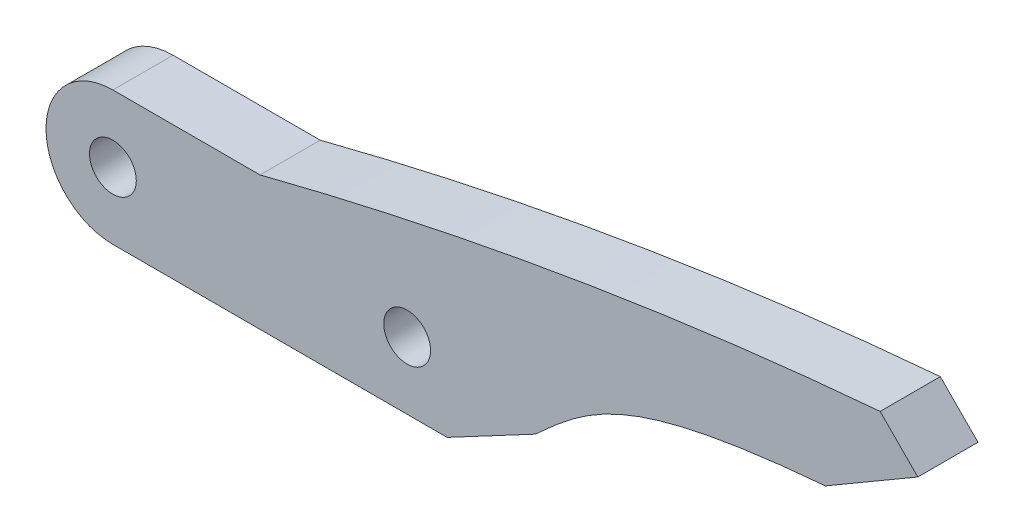
ISO-10303-21;
HEADER;
FILE_DESCRIPTION(('STEP AP214'),'2;1');
FILE_NAME('part.step','',(''),(''),'','','');
FILE_SCHEMA(('AUTOMOTIVE_DESIGN { 1 0 10303 214 1 1 1 1 }'));
ENDSEC;
DATA;
#1=APPLICATION_CONTEXT('core data for automotive mechanical design processes');
#2=APPLICATION_PROTOCOL_DEFINITION('international standard','automotive_design',2000,#1);
#3=PRODUCT_CONTEXT('',#1,'mechanical');
#4=PRODUCT('Part','Part','',(#3));
#5=PRODUCT_RELATED_PRODUCT_CATEGORY('part','',(#4));
#6=PRODUCT_DEFINITION_FORMATION('','',#4);
#7=PRODUCT_DEFINITION_CONTEXT('part definition',#1,'design');
#8=PRODUCT_DEFINITION('design','',#6,#7);
#9=PRODUCT_DEFINITION_SHAPE('','',#8);
#10=(LENGTH_UNIT() NAMED_UNIT(*) SI_UNIT(.MILLI.,.METRE.));
#11=(NAMED_UNIT(*) PLANE_ANGLE_UNIT() SI_UNIT($,.RADIAN.));
#12=(NAMED_UNIT(*) SI_UNIT($,.STERADIAN.) SOLID_ANGLE_UNIT());
#13=UNCERTAINTY_MEASURE_WITH_UNIT(LENGTH_MEASURE(1.E-05),#10,'distance_accuracy_value','');
#14=(GEOMETRIC_REPRESENTATION_CONTEXT(3) GLOBAL_UNCERTAINTY_ASSIGNED_CONTEXT((#13)) GLOBAL_UNIT_ASSIGNED_CONTEXT((#10,
#11,#12)) REPRESENTATION_CONTEXT('',''));
#15=CARTESIAN_POINT('',(0.,0.,0.));
#16=DIRECTION('',(0.,0.,1.));
#17=DIRECTION('',(1.,0.,0.));
#18=AXIS2_PLACEMENT_3D('',#15,#16,#17);
#19=CARTESIAN_POINT('',(0.,5.,4.5));
#20=DIRECTION('',(0.,1.,0.));
#21=DIRECTION('',(0.,0.,1.));
#22=AXIS2_PLACEMENT_3D('',#19,#20,#21);
#23=PLANE('',#22);
#24=DIRECTION('',(1.,0.,0.));
#25=VECTOR('',#24,1.);
#26=CARTESIAN_POINT('',(0.,5.,4.5));
#27=LINE('',#26,#25);
#28=CARTESIAN_POINT('',(-11.,5.,4.5));
#29=VERTEX_POINT('',#28);
#30=CARTESIAN_POINT('',(3.01980662698043E-11,5.,4.5));
#31=VERTEX_POINT('',#30);
#32=EDGE_CURVE('E117',#29,#31,#27,.T.);
#33=ORIENTED_EDGE('',*,*,#32,.T.);
#34=DIRECTION('',(0.,0.,1.));
#35=VECTOR('',#34,1.);
#36=CARTESIAN_POINT('',(3.01980662698043E-11,5.,0.));
#37=LINE('',#36,#35);
#38=CARTESIAN_POINT('',(3.01980662698043E-11,5.,0.));
#39=VERTEX_POINT('',#38);
#40=EDGE_CURVE('E104',#39,#31,#37,.T.);
#41=ORIENTED_EDGE('',*,*,#40,.F.);
#42=DIRECTION('',(1.,0.,0.));
#43=VECTOR('',#42,1.);
#44=CARTESIAN_POINT('',(0.,5.,0.));
#45=LINE('',#44,#43);
#46=CARTESIAN_POINT('',(-11.,5.,0.));
#47=VERTEX_POINT('',#46);
#48=EDGE_CURVE('E97',#47,#39,#45,.T.);
#49=ORIENTED_EDGE('',*,*,#48,.F.);
#50=DIRECTION('',(0.,0.,-1.));
#51=VECTOR('',#50,1.);
#52=CARTESIAN_POINT('',(-11.,5.,4.5));
#53=LINE('',#52,#51);
#54=EDGE_CURVE('E55',#29,#47,#53,.T.);
#55=ORIENTED_EDGE('',*,*,#54,.F.);
#56=EDGE_LOOP('',(#33,#41,#49,#55));
#57=FACE_BOUND('',#56,.T.);
#58=ADVANCED_FACE('F47',(#57),#23,.T.);
#59=CARTESIAN_POINT('',(-11.,0.,4.5));
#60=DIRECTION('',(0.,0.,-1.));
#61=DIRECTION('',(-1.,0.,0.));
#62=AXIS2_PLACEMENT_3D('',#59,#60,#61);
#63=CYLINDRICAL_SURFACE('',#62,5.);
#64=CARTESIAN_POINT('',(-11.,0.,0.));
#65=DIRECTION('',(0.,0.,1.));
#66=DIRECTION('',(1.,0.,0.));
#67=AXIS2_PLACEMENT_3D('',#64,#65,#66);
#68=CIRCLE('',#67,5.);
#69=CARTESIAN_POINT('',(-11.,-5.,0.));
#70=VERTEX_POINT('',#69);
#71=EDGE_CURVE('E85',#47,#70,#68,.T.);
#72=ORIENTED_EDGE('',*,*,#71,.T.);
#73=DIRECTION('',(0.,0.,-1.));
#74=VECTOR('',#73,1.);
#75=CARTESIAN_POINT('',(-11.,-5.,4.5));
#76=LINE('',#75,#74);
#77=CARTESIAN_POINT('',(-11.,-5.,4.5));
#78=VERTEX_POINT('',#77);
#79=EDGE_CURVE('E13',#78,#70,#76,.T.);
#80=ORIENTED_EDGE('',*,*,#79,.F.);
#81=CARTESIAN_POINT('',(-11.,0.,4.5));
#82=DIRECTION('',(0.,0.,1.));
#83=DIRECTION('',(1.,0.,0.));
#84=AXIS2_PLACEMENT_3D('',#81,#82,#83);
#85=CIRCLE('',#84,5.);
#86=EDGE_CURVE('E87',#29,#78,#85,.T.);
#87=ORIENTED_EDGE('',*,*,#86,.F.);
#88=ORIENTED_EDGE('',*,*,#54,.T.);
#89=EDGE_LOOP('',(#72,#80,#87,#88));
#90=FACE_BOUND('',#89,.T.);
#91=ADVANCED_FACE('F83',(#90),#63,.T.);
#92=CARTESIAN_POINT('',(0.,-5.,4.5));
#93=DIRECTION('',(0.,1.,0.));
#94=DIRECTION('',(0.,0.,1.));
#95=AXIS2_PLACEMENT_3D('',#92,#93,#94);
#96=PLANE('',#95);
#97=DIRECTION('',(1.,0.,0.));
#98=VECTOR('',#97,1.);
#99=CARTESIAN_POINT('',(0.,-5.,0.));
#100=LINE('',#99,#98);
#101=CARTESIAN_POINT('',(13.99,-5.,0.));
#102=VERTEX_POINT('',#101);
#103=EDGE_CURVE('E99',#70,#102,#100,.T.);
#104=ORIENTED_EDGE('',*,*,#103,.T.);
#105=DIRECTION('',(0.,0.,1.));
#106=VECTOR('',#105,1.);
#107=CARTESIAN_POINT('',(13.99,-5.,0.));
#108=LINE('',#107,#106);
#109=CARTESIAN_POINT('',(13.99,-5.,4.5));
#110=VERTEX_POINT('',#109);
#111=EDGE_CURVE('E136',#102,#110,#108,.T.);
#112=ORIENTED_EDGE('',*,*,#111,.T.);
#113=DIRECTION('',(1.,0.,0.));
#114=VECTOR('',#113,1.);
#115=CARTESIAN_POINT('',(0.,-5.,4.5));
#116=LINE('',#115,#114);
#117=EDGE_CURVE('E119',#78,#110,#116,.T.);
#118=ORIENTED_EDGE('',*,*,#117,.F.);
#119=ORIENTED_EDGE('',*,*,#79,.T.);
#120=EDGE_LOOP('',(#104,#112,#118,#119));
#121=FACE_BOUND('',#120,.T.);
#122=ADVANCED_FACE('F372',(#121),#96,.F.);
#123=CARTESIAN_POINT('',(-11.,0.,4.5));
#124=DIRECTION('',(0.,0.,-1.));
#125=DIRECTION('',(-1.,0.,0.));
#126=AXIS2_PLACEMENT_3D('',#123,#124,#125);
#127=CYLINDRICAL_SURFACE('',#126,1.75);
#128=CARTESIAN_POINT('',(-11.,0.,4.5));
#129=DIRECTION('',(0.,0.,1.));
#130=DIRECTION('',(1.,0.,0.));
#131=AXIS2_PLACEMENT_3D('',#128,#129,#130);
#132=CIRCLE('',#131,1.75);
#133=CARTESIAN_POINT('',(-9.25,0.,4.5));
#134=VERTEX_POINT('',#133);
#135=EDGE_CURVE('E108',#134,#134,#132,.T.);
#136=ORIENTED_EDGE('',*,*,#135,.T.);
#137=EDGE_LOOP('',(#136));
#138=FACE_BOUND('',#137,.T.);
#139=CARTESIAN_POINT('',(-11.,0.,0.));
#140=DIRECTION('',(0.,0.,1.));
#141=DIRECTION('',(1.,0.,0.));
#142=AXIS2_PLACEMENT_3D('',#139,#140,#141);
#143=CIRCLE('',#142,1.75);
#144=CARTESIAN_POINT('',(-9.25,0.,0.));
#145=VERTEX_POINT('',#144);
#146=EDGE_CURVE('E100',#145,#145,#143,.T.);
#147=ORIENTED_EDGE('',*,*,#146,.F.);
#148=EDGE_LOOP('',(#147));
#149=FACE_BOUND('',#148,.T.);
#150=ADVANCED_FACE('F49',(#138,#149),#127,.F.);
#151=CARTESIAN_POINT('',(11.,0.,4.5));
#152=DIRECTION('',(0.,0.,-1.));
#153=DIRECTION('',(-1.,0.,0.));
#154=AXIS2_PLACEMENT_3D('',#151,#152,#153);
#155=CYLINDRICAL_SURFACE('',#154,1.75);
#156=CARTESIAN_POINT('',(11.,0.,4.5));
#157=DIRECTION('',(0.,0.,1.));
#158=DIRECTION('',(1.,0.,0.));
#159=AXIS2_PLACEMENT_3D('',#156,#157,#158);
#160=CIRCLE('',#159,1.75);
#161=CARTESIAN_POINT('',(12.75,0.,4.5));
#162=VERTEX_POINT('',#161);
#163=EDGE_CURVE('E89',#162,#162,#160,.F.);
#164=ORIENTED_EDGE('',*,*,#163,.F.);
#165=EDGE_LOOP('',(#164));
#166=FACE_BOUND('',#165,.T.);
#167=CARTESIAN_POINT('',(11.,0.,0.));
#168=DIRECTION('',(0.,0.,1.));
#169=DIRECTION('',(1.,0.,0.));
#170=AXIS2_PLACEMENT_3D('',#167,#168,#169);
#171=CIRCLE('',#170,1.75);
#172=CARTESIAN_POINT('',(12.75,0.,0.));
#173=VERTEX_POINT('',#172);
#174=EDGE_CURVE('E105',#173,#173,#171,.F.);
#175=ORIENTED_EDGE('',*,*,#174,.T.);
#176=EDGE_LOOP('',(#175));
#177=FACE_BOUND('',#176,.T.);
#178=ADVANCED_FACE('F375',(#166,#177),#155,.F.);
#179=CARTESIAN_POINT('',(0.,0.,4.5));
#180=DIRECTION('',(0.,0.,1.));
#181=DIRECTION('',(1.,0.,0.));
#182=AXIS2_PLACEMENT_3D('',#179,#180,#181);
#183=PLANE('',#182);
#184=ORIENTED_EDGE('',*,*,#117,.T.);
#185=DIRECTION('',(-0.882942972945771,-0.469480251475697,0.));
#186=VECTOR('',#185,1.);
#187=CARTESIAN_POINT('',(5.15618121918072,-9.69713627016373,4.5));
#188=LINE('',#187,#186);
#189=CARTESIAN_POINT('',(20.61,-1.48,4.5));
#190=VERTEX_POINT('',#189);
#191=EDGE_CURVE('E141',#190,#110,#188,.T.);
#192=ORIENTED_EDGE('',*,*,#191,.F.);
#193=CARTESIAN_POINT('',(42.27,6.,4.5));
#194=CARTESIAN_POINT('',(27.8268946408601,4.7681685575162,4.5));
#195=CARTESIAN_POINT('',(24.7339306645145,2.33179854698705,4.5));
#196=CARTESIAN_POINT('',(20.61,-1.48,4.5));
#197=B_SPLINE_CURVE_WITH_KNOTS('',3,(#193,#194,#195,#196),.UNSPECIFIED.,.F.,.F.,(4,4),(0.,1.),.UNSPECIFIED.);
#198=CARTESIAN_POINT('',(42.27,5.99999999999999,4.5));
#199=VERTEX_POINT('',#198);
#200=EDGE_CURVE('E159',#199,#190,#197,.T.);
#201=ORIENTED_EDGE('',*,*,#200,.F.);
#202=DIRECTION('',(-0.863849487758139,-0.50375,0.));
#203=VECTOR('',#202,1.);
#204=CARTESIAN_POINT('',(8.11562184512604,-13.9169742406966,4.5));
#205=LINE('',#204,#203);
#206=CARTESIAN_POINT('',(49.1807959020651,10.03,4.5));
#207=VERTEX_POINT('',#206);
#208=EDGE_CURVE('E156',#207,#199,#205,.T.);
#209=ORIENTED_EDGE('',*,*,#208,.F.);
#210=DIRECTION('',(0.70420167565833,-0.71,0.));
#211=VECTOR('',#210,1.);
#212=CARTESIAN_POINT('',(29.8068706070967,29.5634482079557,4.5));
#213=LINE('',#212,#211);
#214=CARTESIAN_POINT('',(46.3639891994318,12.87,4.5));
#215=VERTEX_POINT('',#214);
#216=EDGE_CURVE('E150',#215,#207,#213,.T.);
#217=ORIENTED_EDGE('',*,*,#216,.F.);
#218=CARTESIAN_POINT('',(142249.910189862,-990107.98812321,4.5));
#219=CARTESIAN_POINT('',(-165581.177391008,986202.204475749,4.5));
#220=CARTESIAN_POINT('',(189006.482425264,-982256.468536661,4.5));
#221=B_SPLINE_CURVE_WITH_KNOTS('',2,(#218,#219,#220),.UNSPECIFIED.,.F.,.F.,(3,3),(0.,1.),.UNSPECIFIED.);
#222=EDGE_CURVE('E145',#31,#215,#221,.T.);
#223=ORIENTED_EDGE('',*,*,#222,.F.);
#224=ORIENTED_EDGE('',*,*,#32,.F.);
#225=ORIENTED_EDGE('',*,*,#86,.T.);
#226=EDGE_LOOP('',(#184,#192,#201,#209,#217,#223,#224,#225));
#227=FACE_BOUND('',#226,.T.);
#228=ORIENTED_EDGE('',*,*,#135,.F.);
#229=EDGE_LOOP('',(#228));
#230=FACE_BOUND('',#229,.T.);
#231=ORIENTED_EDGE('',*,*,#163,.T.);
#232=EDGE_LOOP('',(#231));
#233=FACE_BOUND('',#232,.T.);
#234=ADVANCED_FACE('F223',(#227,#230,#233),#183,.T.);
#235=CARTESIAN_POINT('',(0.,0.,0.));
#236=DIRECTION('',(0.,0.,1.));
#237=DIRECTION('',(1.,0.,0.));
#238=AXIS2_PLACEMENT_3D('',#235,#236,#237);
#239=PLANE('',#238);
#240=DIRECTION('',(-0.882942972945771,-0.469480251475697,0.));
#241=VECTOR('',#240,1.);
#242=CARTESIAN_POINT('',(5.15618121918072,-9.69713627016373,0.));
#243=LINE('',#242,#241);
#244=CARTESIAN_POINT('',(20.61,-1.48,0.));
#245=VERTEX_POINT('',#244);
#246=EDGE_CURVE('E165',#245,#102,#243,.T.);
#247=ORIENTED_EDGE('',*,*,#246,.T.);
#248=ORIENTED_EDGE('',*,*,#103,.F.);
#249=ORIENTED_EDGE('',*,*,#71,.F.);
#250=ORIENTED_EDGE('',*,*,#48,.T.);
#251=CARTESIAN_POINT('',(142249.910189862,-990107.98812321,0.));
#252=CARTESIAN_POINT('',(-165581.177391008,986202.204475749,0.));
#253=CARTESIAN_POINT('',(189006.482425264,-982256.468536661,0.));
#254=B_SPLINE_CURVE_WITH_KNOTS('',2,(#251,#252,#253),.UNSPECIFIED.,.F.,.F.,(3,3),(0.,1.),.UNSPECIFIED.);
#255=CARTESIAN_POINT('',(46.3639891994318,12.87,0.));
#256=VERTEX_POINT('',#255);
#257=EDGE_CURVE('E170',#39,#256,#254,.T.);
#258=ORIENTED_EDGE('',*,*,#257,.T.);
#259=DIRECTION('',(0.70420167565833,-0.71,0.));
#260=VECTOR('',#259,1.);
#261=CARTESIAN_POINT('',(29.8068706070967,29.5634482079557,0.));
#262=LINE('',#261,#260);
#263=CARTESIAN_POINT('',(49.1807959020651,10.03,0.));
#264=VERTEX_POINT('',#263);
#265=EDGE_CURVE('E175',#256,#264,#262,.T.);
#266=ORIENTED_EDGE('',*,*,#265,.T.);
#267=DIRECTION('',(-0.863849487758139,-0.50375,0.));
#268=VECTOR('',#267,1.);
#269=CARTESIAN_POINT('',(8.11562184512604,-13.9169742406966,0.));
#270=LINE('',#269,#268);
#271=CARTESIAN_POINT('',(42.27,5.99999999999999,0.));
#272=VERTEX_POINT('',#271);
#273=EDGE_CURVE('E230',#264,#272,#270,.T.);
#274=ORIENTED_EDGE('',*,*,#273,.T.);
#275=CARTESIAN_POINT('',(42.27,6.,0.));
#276=CARTESIAN_POINT('',(27.8268946408601,4.7681685575162,0.));
#277=CARTESIAN_POINT('',(24.7339306645145,2.33179854698705,0.));
#278=CARTESIAN_POINT('',(20.61,-1.48,0.));
#279=B_SPLINE_CURVE_WITH_KNOTS('',3,(#275,#276,#277,#278),.UNSPECIFIED.,.F.,.F.,(4,4),(0.,1.),.UNSPECIFIED.);
#280=EDGE_CURVE('E144',#272,#245,#279,.T.);
#281=ORIENTED_EDGE('',*,*,#280,.T.);
#282=EDGE_LOOP('',(#247,#248,#249,#250,#258,#266,#274,#281));
#283=FACE_BOUND('',#282,.T.);
#284=ORIENTED_EDGE('',*,*,#146,.T.);
#285=EDGE_LOOP('',(#284));
#286=FACE_BOUND('',#285,.T.);
#287=ORIENTED_EDGE('',*,*,#174,.F.);
#288=EDGE_LOOP('',(#287));
#289=FACE_BOUND('',#288,.T.);
#290=ADVANCED_FACE('F93',(#283,#286,#289),#239,.F.);
#291=DIRECTION('',(0.,0.,1.));
#292=VECTOR('',#291,1.);
#293=SURFACE_OF_LINEAR_EXTRUSION('',#279,#292);
#294=ORIENTED_EDGE('',*,*,#200,.T.);
#295=DIRECTION('',(0.,0.,1.));
#296=VECTOR('',#295,1.);
#297=CARTESIAN_POINT('',(20.61,-1.48,0.));
#298=LINE('',#297,#296);
#299=EDGE_CURVE('E114',#245,#190,#298,.T.);
#300=ORIENTED_EDGE('',*,*,#299,.F.);
#301=ORIENTED_EDGE('',*,*,#280,.F.);
#302=DIRECTION('',(0.,0.,1.));
#303=VECTOR('',#302,1.);
#304=CARTESIAN_POINT('',(42.27,5.99999999999999,0.));
#305=LINE('',#304,#303);
#306=CARTESIAN_POINT('',(42.27,6.,2.2));
#307=VERTEX_POINT('',#306);
#308=EDGE_CURVE('E125',#272,#307,#305,.T.);
#309=ORIENTED_EDGE('',*,*,#308,.T.);
#310=DIRECTION('',(0.,0.,-1.));
#311=VECTOR('',#310,1.);
#312=CARTESIAN_POINT('',(42.27,6.,2.2));
#313=LINE('',#312,#311);
#314=CARTESIAN_POINT('',(42.27,6.,2.3));
#315=VERTEX_POINT('',#314);
#316=EDGE_CURVE('E282',#315,#307,#313,.T.);
#317=ORIENTED_EDGE('',*,*,#316,.F.);
#318=EDGE_CURVE('E129',#315,#199,#305,.T.);
#319=ORIENTED_EDGE('',*,*,#318,.T.);
#320=EDGE_LOOP('',(#294,#300,#301,#309,#317,#319));
#321=FACE_BOUND('',#320,.T.);
#322=ADVANCED_FACE('F218',(#321),#293,.F.);
#323=CARTESIAN_POINT('',(5.15618121918072,-9.69713627016373,0.));
#324=DIRECTION('',(-0.469480251475697,0.882942972945771,0.));
#325=DIRECTION('',(-0.882942972945771,-0.469480251475697,0.));
#326=AXIS2_PLACEMENT_3D('',#323,#324,#325);
#327=PLANE('',#326);
#328=ORIENTED_EDGE('',*,*,#191,.T.);
#329=ORIENTED_EDGE('',*,*,#111,.F.);
#330=ORIENTED_EDGE('',*,*,#246,.F.);
#331=ORIENTED_EDGE('',*,*,#299,.T.);
#332=EDGE_LOOP('',(#328,#329,#330,#331));
#333=FACE_BOUND('',#332,.T.);
#334=ADVANCED_FACE('F187',(#333),#327,.F.);
#335=DIRECTION('',(0.,0.,1.));
#336=VECTOR('',#335,1.);
#337=SURFACE_OF_LINEAR_EXTRUSION('',#254,#336);
#338=ORIENTED_EDGE('',*,*,#222,.T.);
#339=DIRECTION('',(0.,0.,1.));
#340=VECTOR('',#339,1.);
#341=CARTESIAN_POINT('',(46.3639891994318,12.87,0.));
#342=LINE('',#341,#340);
#343=EDGE_CURVE('E132',#256,#215,#342,.T.);
#344=ORIENTED_EDGE('',*,*,#343,.F.);
#345=ORIENTED_EDGE('',*,*,#257,.F.);
#346=ORIENTED_EDGE('',*,*,#40,.T.);
#347=EDGE_LOOP('',(#338,#344,#345,#346));
#348=FACE_BOUND('',#347,.T.);
#349=ADVANCED_FACE('F181',(#348),#337,.F.);
#350=CARTESIAN_POINT('',(29.8068706070967,29.5634482079557,0.));
#351=DIRECTION('',(-0.71,-0.70420167565833,0.));
#352=DIRECTION('',(0.70420167565833,-0.71,0.));
#353=AXIS2_PLACEMENT_3D('',#350,#351,#352);
#354=PLANE('',#353);
#355=ORIENTED_EDGE('',*,*,#216,.T.);
#356=DIRECTION('',(0.,0.,1.));
#357=VECTOR('',#356,1.);
#358=CARTESIAN_POINT('',(49.1807959020651,10.03,0.));
#359=LINE('',#358,#357);
#360=EDGE_CURVE('E128',#264,#207,#359,.T.);
#361=ORIENTED_EDGE('',*,*,#360,.F.);
#362=ORIENTED_EDGE('',*,*,#265,.F.);
#363=ORIENTED_EDGE('',*,*,#343,.T.);
#364=EDGE_LOOP('',(#355,#361,#362,#363));
#365=FACE_BOUND('',#364,.T.);
#366=ADVANCED_FACE('F186',(#365),#354,.F.);
#367=CARTESIAN_POINT('',(8.11562184512604,-13.9169742406966,0.));
#368=DIRECTION('',(-0.50375,0.863849487758139,0.));
#369=DIRECTION('',(-0.86384948775814,-0.50375,0.));
#370=AXIS2_PLACEMENT_3D('',#367,#368,#369);
#371=PLANE('',#370);
#372=DIRECTION('',(0.,0.,1.));
#373=VECTOR('',#372,1.);
#374=CARTESIAN_POINT('',(46.3639891994318,8.3873916561159,2.2));
#375=LINE('',#374,#373);
#376=CARTESIAN_POINT('',(46.3639891994318,8.38739165611589,2.2));
#377=VERTEX_POINT('',#376);
#378=CARTESIAN_POINT('',(46.3639891994318,8.3873916561159,2.3));
#379=VERTEX_POINT('',#378);
#380=EDGE_CURVE('E318',#377,#379,#375,.T.);
#381=ORIENTED_EDGE('',*,*,#380,.F.);
#382=DIRECTION('',(0.86384948775814,0.50375,0.));
#383=VECTOR('',#382,1.);
#384=CARTESIAN_POINT('',(42.27,6.,2.2));
#385=LINE('',#384,#383);
#386=EDGE_CURVE('E62',#307,#377,#385,.T.);
#387=ORIENTED_EDGE('',*,*,#386,.F.);
#388=ORIENTED_EDGE('',*,*,#308,.F.);
#389=ORIENTED_EDGE('',*,*,#273,.F.);
#390=ORIENTED_EDGE('',*,*,#360,.T.);
#391=ORIENTED_EDGE('',*,*,#208,.T.);
#392=ORIENTED_EDGE('',*,*,#318,.F.);
#393=DIRECTION('',(-0.86384948775814,-0.50375,0.));
#394=VECTOR('',#393,1.);
#395=CARTESIAN_POINT('',(42.27,6.,2.3));
#396=LINE('',#395,#394);
#397=EDGE_CURVE('E310',#379,#315,#396,.T.);
#398=ORIENTED_EDGE('',*,*,#397,.F.);
#399=EDGE_LOOP('',(#381,#387,#388,#389,#390,#391,#392,#398));
#400=FACE_BOUND('',#399,.T.);
#401=ADVANCED_FACE('F212',(#400),#371,.F.);
#402=CARTESIAN_POINT('',(23.896562115994,37.5074638301827,2.2));
#403=DIRECTION('',(0.,0.,-1.));
#404=DIRECTION('',(-1.,0.,0.));
#405=AXIS2_PLACEMENT_3D('',#402,#403,#404);
#406=PLANE('',#405);
#407=CARTESIAN_POINT('',(46.4987937619311,12.3796254635599,2.2));
#408=CARTESIAN_POINT('',(45.8640637231316,12.3259836253143,2.2));
#409=CARTESIAN_POINT('',(45.2295145571373,12.2702010055747,2.2));
#410=CARTESIAN_POINT('',(43.9609532143991,12.1543638097082,2.2));
#411=CARTESIAN_POINT('',(43.3269409478016,12.09431021757,2.2));
#412=CARTESIAN_POINT('',(42.059453759151,11.9699274981896,2.2));
#413=CARTESIAN_POINT('',(41.4259787596686,11.9055991600069,2.2));
#414=CARTESIAN_POINT('',(40.1595664753476,11.7726635732902,2.2));
#415=CARTESIAN_POINT('',(39.5266291282463,11.7040569179158,2.2));
#416=CARTESIAN_POINT('',(38.2612925121409,11.5625612606272,2.2));
#417=CARTESIAN_POINT('',(37.6288931988053,11.4896726551598,2.2));
#418=CARTESIAN_POINT('',(36.3646330127682,11.3396096711777,2.2));
#419=CARTESIAN_POINT('',(35.7327721164447,11.2624354916796,2.2));
#420=CARTESIAN_POINT('',(34.4695882623038,11.1037978150936,2.2));
#421=CARTESIAN_POINT('',(33.8382653050991,11.0223343131283,2.2));
#422=CARTESIAN_POINT('',(32.5761586980429,10.855114668265,2.2));
#423=CARTESIAN_POINT('',(31.9453750742339,10.7693583288061,2.2));
#424=CARTESIAN_POINT('',(30.6843476376886,10.5935495829083,2.2));
#425=CARTESIAN_POINT('',(30.0541038799498,10.5034967819832,2.2));
#426=CARTESIAN_POINT('',(28.7941566745682,10.3190917009756,2.2));
#427=CARTESIAN_POINT('',(28.1644533136703,10.2247388282043,2.2));
#428=CARTESIAN_POINT('',(26.9055874067046,10.0317301322074,2.2));
#429=CARTESIAN_POINT('',(26.2764249819224,9.93307351791277,2.2));
#430=CARTESIAN_POINT('',(25.018641418831,9.73145407939131,2.2));
#431=CARTESIAN_POINT('',(24.3900204391299,9.62849026570367,2.2));
#432=CARTESIAN_POINT('',(23.7617575534977,9.52338589829775,2.2));
#433=B_SPLINE_CURVE_WITH_KNOTS('',3,(#407,#408,#409,#410,#411,#412,#413,#414,#415,#416,#417,
#418,#419,#420,#421,#422,#423,#424,#425,#426,#427,#428,#429,#430,#431,#432),.UNSPECIFIED.,.F.,
.F.,(4,2,2,2,2,2,2,2,2,2,2,2,4),(0.,1.91097447363621,3.82151009557642,5.73169403320308,
7.64161372304668,9.55135685963096,11.4610113841946,13.3706680803282,15.2804122961164,
17.1903321967169,19.1005161468826,21.0110526989636,22.9220305808387),.UNSPECIFIED.);
#434=CARTESIAN_POINT('',(44.1570542041962,12.1719269715466,2.2));
#435=VERTEX_POINT('',#434);
#436=CARTESIAN_POINT('',(38.9793971712901,11.6428497627771,2.2));
#437=VERTEX_POINT('',#436);
#438=EDGE_CURVE('E334',#435,#437,#433,.T.);
#439=ORIENTED_EDGE('',*,*,#438,.T.);
#440=DIRECTION('',(0.50375,-0.863849487758139,0.));
#441=VECTOR('',#440,1.);
#442=CARTESIAN_POINT('',(23.896562115994,37.5074638301827,2.2));
#443=LINE('',#442,#441);
#444=EDGE_CURVE('E325',#437,#307,#443,.T.);
#445=ORIENTED_EDGE('',*,*,#444,.T.);
#446=ORIENTED_EDGE('',*,*,#386,.T.);
#447=DIRECTION('',(0.50375,-0.863849487758139,0.));
#448=VECTOR('',#447,1.);
#449=CARTESIAN_POINT('',(27.9905513154258,39.8948554862986,2.2));
#450=LINE('',#449,#448);
#451=EDGE_CURVE('E316',#435,#377,#450,.T.);
#452=ORIENTED_EDGE('',*,*,#451,.F.);
#453=EDGE_LOOP('',(#439,#445,#446,#452));
#454=FACE_BOUND('',#453,.T.);
#455=ADVANCED_FACE('F216',(#454),#406,.F.);
#456=CARTESIAN_POINT('',(23.896562115994,37.5074638301827,2.2));
#457=DIRECTION('',(-0.863849487758139,-0.50375,0.));
#458=DIRECTION('',(0.50375,-0.863849487758139,0.));
#459=AXIS2_PLACEMENT_3D('',#456,#457,#458);
#460=PLANE('',#459);
#461=DIRECTION('',(0.,0.,1.));
#462=VECTOR('',#461,1.);
#463=CARTESIAN_POINT('',(38.9793971712901,11.6428497627771,0.));
#464=LINE('',#463,#462);
#465=CARTESIAN_POINT('',(38.9793971712777,11.6428497627766,2.3));
#466=VERTEX_POINT('',#465);
#467=EDGE_CURVE('E331',#437,#466,#464,.T.);
#468=ORIENTED_EDGE('',*,*,#467,.T.);
#469=DIRECTION('',(0.50375,-0.863849487758139,0.));
#470=VECTOR('',#469,1.);
#471=CARTESIAN_POINT('',(23.896562115994,37.5074638301827,2.3));
#472=LINE('',#471,#470);
#473=EDGE_CURVE('E315',#466,#315,#472,.T.);
#474=ORIENTED_EDGE('',*,*,#473,.T.);
#475=ORIENTED_EDGE('',*,*,#316,.T.);
#476=ORIENTED_EDGE('',*,*,#444,.F.);
#477=EDGE_LOOP('',(#468,#474,#475,#476));
#478=FACE_BOUND('',#477,.T.);
#479=ADVANCED_FACE('F328',(#478),#460,.F.);
#480=CARTESIAN_POINT('',(23.896562115994,37.5074638301827,2.3));
#481=DIRECTION('',(0.,0.,1.));
#482=DIRECTION('',(1.,0.,0.));
#483=AXIS2_PLACEMENT_3D('',#480,#481,#482);
#484=PLANE('',#483);
#485=CARTESIAN_POINT('',(23.7617575534911,9.5233858983115,2.3));
#486=CARTESIAN_POINT('',(24.3900204391326,9.62849026565794,2.3));
#487=CARTESIAN_POINT('',(25.0186414188335,9.73145407934683,2.3));
#488=CARTESIAN_POINT('',(26.2764249819197,9.93307351790266,2.3));
#489=CARTESIAN_POINT('',(26.905587406697,10.0317301322304,2.3));
#490=CARTESIAN_POINT('',(28.1644533136616,10.2247388282357,2.3));
#491=CARTESIAN_POINT('',(28.7941566745633,10.3190917009822,2.3));
#492=CARTESIAN_POINT('',(30.054103879947,10.5034967819775,2.3));
#493=CARTESIAN_POINT('',(30.6843476376841,10.5935495829151,2.3));
#494=CARTESIAN_POINT('',(31.9453750742311,10.7693583288023,2.3));
#495=CARTESIAN_POINT('',(32.5761586980434,10.8551146682382,2.3));
#496=CARTESIAN_POINT('',(33.8382653051,11.0223343131003,2.3));
#497=CARTESIAN_POINT('',(34.4695882623018,11.1037978150875,2.3));
#498=CARTESIAN_POINT('',(35.7327721164406,11.2624354916885,2.3));
#499=CARTESIAN_POINT('',(36.3646330127652,11.3396096711798,2.3));
#500=CARTESIAN_POINT('',(37.6288931988031,11.4896726551571,2.3));
#501=CARTESIAN_POINT('',(38.2612925121386,11.5625612606263,2.3));
#502=CARTESIAN_POINT('',(39.526629128244,11.7040569179162,2.3));
#503=CARTESIAN_POINT('',(40.1595664753454,11.7726635732898,2.3));
#504=CARTESIAN_POINT('',(41.4259787596666,11.9055991600069,2.3));
#505=CARTESIAN_POINT('',(42.059453759149,11.9699274981907,2.3));
#506=CARTESIAN_POINT('',(43.3269409477997,12.0943102175713,2.3));
#507=CARTESIAN_POINT('',(43.9609532143974,12.1543638097087,2.3));
#508=CARTESIAN_POINT('',(45.2295145571359,12.2702010055739,2.3));
#509=CARTESIAN_POINT('',(45.8640637231303,12.3259836253131,2.3));
#510=CARTESIAN_POINT('',(46.4987937619298,12.3796254635598,2.3));
#511=B_SPLINE_CURVE_WITH_KNOTS('',3,(#485,#486,#487,#488,#489,#490,#491,#492,#493,#494,#495,
#496,#497,#498,#499,#500,#501,#502,#503,#504,#505,#506,#507,#508,#509,#510),.UNSPECIFIED.,.F.,
.F.,(4,2,2,2,2,2,2,2,2,2,2,2,4),(0.,1.91097788187468,3.82151443395653,5.7316983841224,
7.64161828472322,9.55136250051195,11.4610191966453,13.3706737212093,15.2804168577938,
17.1903365476377,19.1005204852646,21.0110561072051,22.9220305808416),.UNSPECIFIED.);
#512=CARTESIAN_POINT('',(44.1570542041975,12.1719269715474,2.3));
#513=VERTEX_POINT('',#512);
#514=EDGE_CURVE('E312',#466,#513,#511,.T.);
#515=ORIENTED_EDGE('',*,*,#514,.T.);
#516=DIRECTION('',(0.50375,-0.863849487758139,0.));
#517=VECTOR('',#516,1.);
#518=CARTESIAN_POINT('',(27.9905513154258,39.8948554862986,2.3));
#519=LINE('',#518,#517);
#520=EDGE_CURVE('E306',#513,#379,#519,.T.);
#521=ORIENTED_EDGE('',*,*,#520,.T.);
#522=ORIENTED_EDGE('',*,*,#397,.T.);
#523=ORIENTED_EDGE('',*,*,#473,.F.);
#524=EDGE_LOOP('',(#515,#521,#522,#523));
#525=FACE_BOUND('',#524,.T.);
#526=ADVANCED_FACE('F308',(#525),#484,.F.);
#527=CARTESIAN_POINT('',(27.9905513154258,39.8948554862986,2.2));
#528=DIRECTION('',(0.863849487758139,0.50375,0.));
#529=DIRECTION('',(-0.50375,0.863849487758139,0.));
#530=AXIS2_PLACEMENT_3D('',#527,#528,#529);
#531=PLANE('',#530);
#532=DIRECTION('',(0.,0.,1.));
#533=VECTOR('',#532,1.);
#534=CARTESIAN_POINT('',(44.1570542041962,12.1719269715466,0.));
#535=LINE('',#534,#533);
#536=EDGE_CURVE('E164',#513,#435,#535,.F.);
#537=ORIENTED_EDGE('',*,*,#536,.T.);
#538=ORIENTED_EDGE('',*,*,#451,.T.);
#539=ORIENTED_EDGE('',*,*,#380,.T.);
#540=ORIENTED_EDGE('',*,*,#520,.F.);
#541=EDGE_LOOP('',(#537,#538,#539,#540));
#542=FACE_BOUND('',#541,.T.);
#543=ADVANCED_FACE('F319',(#542),#531,.F.);
#544=CARTESIAN_POINT('',(142249.910189862,-990107.98812321,0.));
#545=CARTESIAN_POINT('',(-165581.177391008,986202.204475749,0.));
#546=CARTESIAN_POINT('',(189006.482425264,-982256.468536661,0.));
#547=B_SPLINE_CURVE_WITH_KNOTS('',2,(#544,#545,#546),.UNSPECIFIED.,.F.,.F.,(3,3),(0.,1.),.UNSPECIFIED.);
#548=DIRECTION('',(0.,0.,1.));
#549=VECTOR('',#548,1.);
#550=SURFACE_OF_LINEAR_EXTRUSION('',#547,#549);
#551=OFFSET_SURFACE('',#550,0.5,.F.);
#552=ORIENTED_EDGE('',*,*,#438,.F.);
#553=ORIENTED_EDGE('',*,*,#536,.F.);
#554=ORIENTED_EDGE('',*,*,#514,.F.);
#555=ORIENTED_EDGE('',*,*,#467,.F.);
#556=EDGE_LOOP('',(#552,#553,#554,#555));
#557=FACE_BOUND('',#556,.T.);
#558=ADVANCED_FACE('F336',(#557),#551,.T.);
#559=CLOSED_SHELL('',(#58,#91,#122,#150,#178,#234,#290,#322,#334,#349,#366,#401,#455,#479,#526,
#543,#558));
#560=MANIFOLD_SOLID_BREP('B2',#559);
#561=ADVANCED_BREP_SHAPE_REPRESENTATION('',(#18,#560),#14);
#562=SHAPE_DEFINITION_REPRESENTATION(#9,#561);
ENDSEC;
END-ISO-10303-21;
